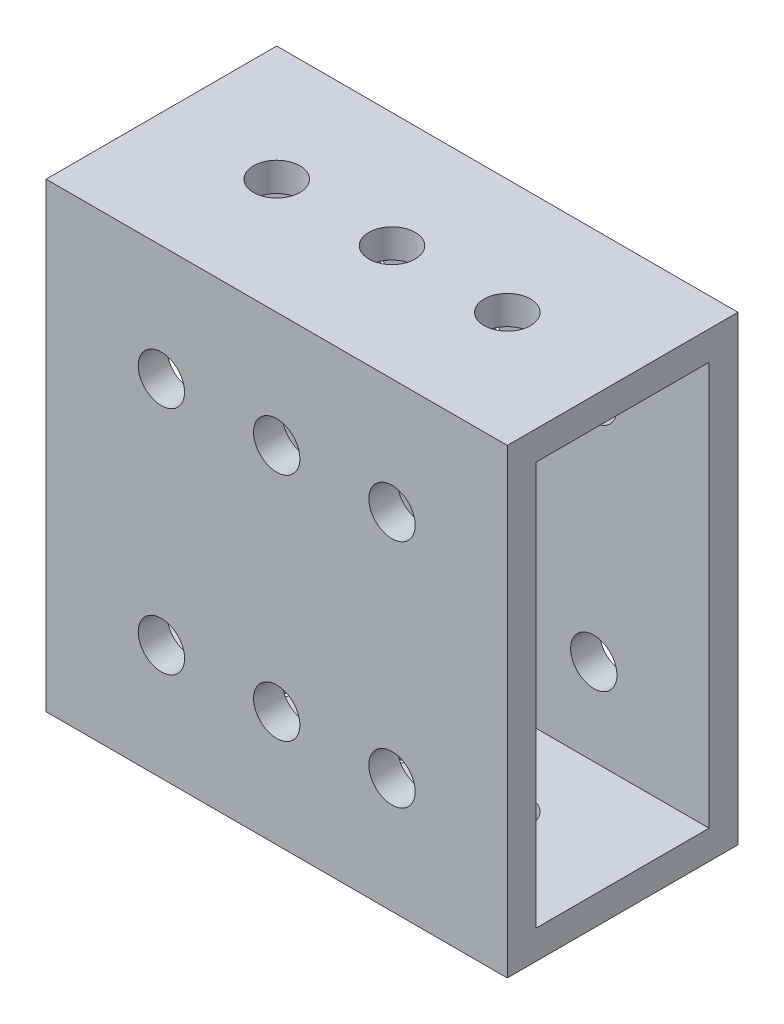
ISO-10303-21;
HEADER;
FILE_DESCRIPTION(('STEP AP214'),'2;1');
FILE_NAME('part.step','',(''),(''),'','','');
FILE_SCHEMA(('AUTOMOTIVE_DESIGN { 1 0 10303 214 1 1 1 1 }'));
ENDSEC;
DATA;
#1=APPLICATION_CONTEXT('core data for automotive mechanical design processes');
#2=APPLICATION_PROTOCOL_DEFINITION('international standard','automotive_design',2000,#1);
#3=PRODUCT_CONTEXT('',#1,'mechanical');
#4=PRODUCT('Part','Part','',(#3));
#5=PRODUCT_RELATED_PRODUCT_CATEGORY('part','',(#4));
#6=PRODUCT_DEFINITION_FORMATION('','',#4);
#7=PRODUCT_DEFINITION_CONTEXT('part definition',#1,'design');
#8=PRODUCT_DEFINITION('design','',#6,#7);
#9=PRODUCT_DEFINITION_SHAPE('','',#8);
#10=(LENGTH_UNIT() NAMED_UNIT(*) SI_UNIT(.MILLI.,.METRE.));
#11=(NAMED_UNIT(*) PLANE_ANGLE_UNIT() SI_UNIT($,.RADIAN.));
#12=(NAMED_UNIT(*) SI_UNIT($,.STERADIAN.) SOLID_ANGLE_UNIT());
#13=UNCERTAINTY_MEASURE_WITH_UNIT(LENGTH_MEASURE(1.E-05),#10,'distance_accuracy_value','');
#14=(GEOMETRIC_REPRESENTATION_CONTEXT(3) GLOBAL_UNCERTAINTY_ASSIGNED_CONTEXT((#13)) GLOBAL_UNIT_ASSIGNED_CONTEXT((#10,
#11,#12)) REPRESENTATION_CONTEXT('',''));
#15=CARTESIAN_POINT('',(0.,0.,0.));
#16=DIRECTION('',(0.,0.,1.));
#17=DIRECTION('',(1.,0.,0.));
#18=AXIS2_PLACEMENT_3D('',#15,#16,#17);
#19=CARTESIAN_POINT('',(0.,0.,25.4));
#20=DIRECTION('',(1.,0.,0.));
#21=DIRECTION('',(0.,0.,-1.));
#22=AXIS2_PLACEMENT_3D('',#19,#20,#21);
#23=PLANE('',#22);
#24=DIRECTION('',(0.,0.,-1.));
#25=VECTOR('',#24,1.);
#26=CARTESIAN_POINT('',(0.,3.175,22.225));
#27=LINE('',#26,#25);
#28=CARTESIAN_POINT('',(0.,3.175,22.225));
#29=VERTEX_POINT('',#28);
#30=CARTESIAN_POINT('',(0.,3.175,3.175));
#31=VERTEX_POINT('',#30);
#32=EDGE_CURVE('E108',#29,#31,#27,.T.);
#33=ORIENTED_EDGE('',*,*,#32,.T.);
#34=DIRECTION('',(0.,1.,0.));
#35=VECTOR('',#34,1.);
#36=CARTESIAN_POINT('',(0.,3.175,3.175));
#37=LINE('',#36,#35);
#38=CARTESIAN_POINT('',(0.,47.625,3.175));
#39=VERTEX_POINT('',#38);
#40=EDGE_CURVE('E102',#31,#39,#37,.T.);
#41=ORIENTED_EDGE('',*,*,#40,.T.);
#42=DIRECTION('',(0.,0.,1.));
#43=VECTOR('',#42,1.);
#44=CARTESIAN_POINT('',(0.,47.625,22.225));
#45=LINE('',#44,#43);
#46=CARTESIAN_POINT('',(0.,47.625,22.225));
#47=VERTEX_POINT('',#46);
#48=EDGE_CURVE('E111',#39,#47,#45,.T.);
#49=ORIENTED_EDGE('',*,*,#48,.T.);
#50=DIRECTION('',(0.,-1.,0.));
#51=VECTOR('',#50,1.);
#52=CARTESIAN_POINT('',(0.,3.175,22.225));
#53=LINE('',#52,#51);
#54=EDGE_CURVE('E50',#47,#29,#53,.T.);
#55=ORIENTED_EDGE('',*,*,#54,.T.);
#56=EDGE_LOOP('',(#33,#41,#49,#55));
#57=FACE_BOUND('',#56,.T.);
#58=DIRECTION('',(0.,-1.,0.));
#59=VECTOR('',#58,1.);
#60=CARTESIAN_POINT('',(0.,0.,0.));
#61=LINE('',#60,#59);
#62=CARTESIAN_POINT('',(0.,50.8,0.));
#63=VERTEX_POINT('',#62);
#64=CARTESIAN_POINT('',(0.,0.,0.));
#65=VERTEX_POINT('',#64);
#66=EDGE_CURVE('E135',#63,#65,#61,.T.);
#67=ORIENTED_EDGE('',*,*,#66,.T.);
#68=DIRECTION('',(0.,0.,-1.));
#69=VECTOR('',#68,1.);
#70=CARTESIAN_POINT('',(0.,0.,25.4));
#71=LINE('',#70,#69);
#72=CARTESIAN_POINT('',(0.,0.,25.4));
#73=VERTEX_POINT('',#72);
#74=EDGE_CURVE('E11',#73,#65,#71,.T.);
#75=ORIENTED_EDGE('',*,*,#74,.F.);
#76=DIRECTION('',(0.,-1.,0.));
#77=VECTOR('',#76,1.);
#78=CARTESIAN_POINT('',(0.,0.,25.4));
#79=LINE('',#78,#77);
#80=CARTESIAN_POINT('',(0.,50.8,25.4));
#81=VERTEX_POINT('',#80);
#82=EDGE_CURVE('E139',#81,#73,#79,.T.);
#83=ORIENTED_EDGE('',*,*,#82,.F.);
#84=DIRECTION('',(0.,0.,-1.));
#85=VECTOR('',#84,1.);
#86=CARTESIAN_POINT('',(0.,50.8,25.4));
#87=LINE('',#86,#85);
#88=EDGE_CURVE('E149',#81,#63,#87,.T.);
#89=ORIENTED_EDGE('',*,*,#88,.T.);
#90=EDGE_LOOP('',(#67,#75,#83,#89));
#91=FACE_BOUND('',#90,.T.);
#92=ADVANCED_FACE('F34',(#57,#91),#23,.F.);
#93=CARTESIAN_POINT('',(0.,0.,25.4));
#94=DIRECTION('',(0.,1.,0.));
#95=DIRECTION('',(0.,0.,1.));
#96=AXIS2_PLACEMENT_3D('',#93,#94,#95);
#97=PLANE('',#96);
#98=CARTESIAN_POINT('',(12.7,0.,12.7));
#99=DIRECTION('',(0.,1.,0.));
#100=DIRECTION('',(0.,0.,1.));
#101=AXIS2_PLACEMENT_3D('',#98,#99,#100);
#102=CIRCLE('',#101,2.5527);
#103=CARTESIAN_POINT('',(12.7,0.,15.2527));
#104=VERTEX_POINT('',#103);
#105=EDGE_CURVE('E168',#104,#104,#102,.T.);
#106=ORIENTED_EDGE('',*,*,#105,.T.);
#107=EDGE_LOOP('',(#106));
#108=FACE_BOUND('',#107,.T.);
#109=CARTESIAN_POINT('',(25.4,0.,12.7));
#110=DIRECTION('',(0.,1.,0.));
#111=DIRECTION('',(0.,0.,1.));
#112=AXIS2_PLACEMENT_3D('',#109,#110,#111);
#113=CIRCLE('',#112,2.5527);
#114=CARTESIAN_POINT('',(25.4,0.,15.2527));
#115=VERTEX_POINT('',#114);
#116=EDGE_CURVE('E215',#115,#115,#113,.T.);
#117=ORIENTED_EDGE('',*,*,#116,.T.);
#118=EDGE_LOOP('',(#117));
#119=FACE_BOUND('',#118,.T.);
#120=CARTESIAN_POINT('',(38.1,0.,12.7));
#121=DIRECTION('',(0.,1.,0.));
#122=DIRECTION('',(0.,0.,1.));
#123=AXIS2_PLACEMENT_3D('',#120,#121,#122);
#124=CIRCLE('',#123,2.5527);
#125=CARTESIAN_POINT('',(38.1,0.,15.2527));
#126=VERTEX_POINT('',#125);
#127=EDGE_CURVE('E221',#126,#126,#124,.T.);
#128=ORIENTED_EDGE('',*,*,#127,.T.);
#129=EDGE_LOOP('',(#128));
#130=FACE_BOUND('',#129,.T.);
#131=DIRECTION('',(1.,0.,0.));
#132=VECTOR('',#131,1.);
#133=CARTESIAN_POINT('',(0.,0.,0.));
#134=LINE('',#133,#132);
#135=CARTESIAN_POINT('',(50.8,0.,0.));
#136=VERTEX_POINT('',#135);
#137=EDGE_CURVE('E152',#65,#136,#134,.T.);
#138=ORIENTED_EDGE('',*,*,#137,.T.);
#139=DIRECTION('',(0.,0.,-1.));
#140=VECTOR('',#139,1.);
#141=CARTESIAN_POINT('',(50.8,0.,25.4));
#142=LINE('',#141,#140);
#143=CARTESIAN_POINT('',(50.8,0.,25.4));
#144=VERTEX_POINT('',#143);
#145=EDGE_CURVE('E42',#144,#136,#142,.T.);
#146=ORIENTED_EDGE('',*,*,#145,.F.);
#147=DIRECTION('',(1.,0.,0.));
#148=VECTOR('',#147,1.);
#149=CARTESIAN_POINT('',(0.,0.,25.4));
#150=LINE('',#149,#148);
#151=EDGE_CURVE('E142',#73,#144,#150,.T.);
#152=ORIENTED_EDGE('',*,*,#151,.F.);
#153=ORIENTED_EDGE('',*,*,#74,.T.);
#154=EDGE_LOOP('',(#138,#146,#152,#153));
#155=FACE_BOUND('',#154,.T.);
#156=ADVANCED_FACE('F255',(#108,#119,#130,#155),#97,.F.);
#157=CARTESIAN_POINT('',(50.8,0.,25.4));
#158=DIRECTION('',(-1.,0.,0.));
#159=DIRECTION('',(0.,0.,1.));
#160=AXIS2_PLACEMENT_3D('',#157,#158,#159);
#161=PLANE('',#160);
#162=DIRECTION('',(0.,0.,1.));
#163=VECTOR('',#162,1.);
#164=CARTESIAN_POINT('',(50.8,47.625,22.225));
#165=LINE('',#164,#163);
#166=CARTESIAN_POINT('',(50.8,47.625,3.175));
#167=VERTEX_POINT('',#166);
#168=CARTESIAN_POINT('',(50.8,47.625,22.225));
#169=VERTEX_POINT('',#168);
#170=EDGE_CURVE('E129',#167,#169,#165,.T.);
#171=ORIENTED_EDGE('',*,*,#170,.F.);
#172=DIRECTION('',(0.,1.,0.));
#173=VECTOR('',#172,1.);
#174=CARTESIAN_POINT('',(50.8,3.175,3.175));
#175=LINE('',#174,#173);
#176=CARTESIAN_POINT('',(50.8,3.175,3.175));
#177=VERTEX_POINT('',#176);
#178=EDGE_CURVE('E58',#177,#167,#175,.T.);
#179=ORIENTED_EDGE('',*,*,#178,.F.);
#180=DIRECTION('',(0.,0.,-1.));
#181=VECTOR('',#180,1.);
#182=CARTESIAN_POINT('',(50.8,3.175,22.225));
#183=LINE('',#182,#181);
#184=CARTESIAN_POINT('',(50.8,3.175,22.225));
#185=VERTEX_POINT('',#184);
#186=EDGE_CURVE('E117',#185,#177,#183,.T.);
#187=ORIENTED_EDGE('',*,*,#186,.F.);
#188=DIRECTION('',(0.,-1.,0.));
#189=VECTOR('',#188,1.);
#190=CARTESIAN_POINT('',(50.8,3.175,22.225));
#191=LINE('',#190,#189);
#192=EDGE_CURVE('E120',#169,#185,#191,.T.);
#193=ORIENTED_EDGE('',*,*,#192,.F.);
#194=EDGE_LOOP('',(#171,#179,#187,#193));
#195=FACE_BOUND('',#194,.T.);
#196=DIRECTION('',(0.,1.,0.));
#197=VECTOR('',#196,1.);
#198=CARTESIAN_POINT('',(50.8,0.,0.));
#199=LINE('',#198,#197);
#200=CARTESIAN_POINT('',(50.8,50.8,0.));
#201=VERTEX_POINT('',#200);
#202=EDGE_CURVE('E154',#136,#201,#199,.T.);
#203=ORIENTED_EDGE('',*,*,#202,.T.);
#204=DIRECTION('',(0.,0.,-1.));
#205=VECTOR('',#204,1.);
#206=CARTESIAN_POINT('',(50.8,50.8,25.4));
#207=LINE('',#206,#205);
#208=CARTESIAN_POINT('',(50.8,50.8,25.4));
#209=VERTEX_POINT('',#208);
#210=EDGE_CURVE('E159',#209,#201,#207,.T.);
#211=ORIENTED_EDGE('',*,*,#210,.F.);
#212=DIRECTION('',(0.,1.,0.));
#213=VECTOR('',#212,1.);
#214=CARTESIAN_POINT('',(50.8,0.,25.4));
#215=LINE('',#214,#213);
#216=EDGE_CURVE('E145',#144,#209,#215,.T.);
#217=ORIENTED_EDGE('',*,*,#216,.F.);
#218=ORIENTED_EDGE('',*,*,#145,.T.);
#219=EDGE_LOOP('',(#203,#211,#217,#218));
#220=FACE_BOUND('',#219,.T.);
#221=ADVANCED_FACE('F259',(#195,#220),#161,.F.);
#222=CARTESIAN_POINT('',(0.,50.8,25.4));
#223=DIRECTION('',(0.,-1.,0.));
#224=DIRECTION('',(0.,0.,-1.));
#225=AXIS2_PLACEMENT_3D('',#222,#223,#224);
#226=PLANE('',#225);
#227=CARTESIAN_POINT('',(12.7,50.8,12.7));
#228=DIRECTION('',(0.,1.,0.));
#229=DIRECTION('',(0.,0.,1.));
#230=AXIS2_PLACEMENT_3D('',#227,#228,#229);
#231=CIRCLE('',#230,2.5527);
#232=CARTESIAN_POINT('',(12.7,50.8,15.2527));
#233=VERTEX_POINT('',#232);
#234=EDGE_CURVE('E212',#233,#233,#231,.T.);
#235=ORIENTED_EDGE('',*,*,#234,.F.);
#236=EDGE_LOOP('',(#235));
#237=FACE_BOUND('',#236,.T.);
#238=CARTESIAN_POINT('',(25.4,50.8,12.7));
#239=DIRECTION('',(0.,1.,0.));
#240=DIRECTION('',(0.,0.,1.));
#241=AXIS2_PLACEMENT_3D('',#238,#239,#240);
#242=CIRCLE('',#241,2.5527);
#243=CARTESIAN_POINT('',(25.4,50.8,15.2527));
#244=VERTEX_POINT('',#243);
#245=EDGE_CURVE('E218',#244,#244,#242,.T.);
#246=ORIENTED_EDGE('',*,*,#245,.F.);
#247=EDGE_LOOP('',(#246));
#248=FACE_BOUND('',#247,.T.);
#249=CARTESIAN_POINT('',(38.1,50.8,12.7));
#250=DIRECTION('',(0.,1.,0.));
#251=DIRECTION('',(0.,0.,1.));
#252=AXIS2_PLACEMENT_3D('',#249,#250,#251);
#253=CIRCLE('',#252,2.5527);
#254=CARTESIAN_POINT('',(38.1,50.8,15.2527));
#255=VERTEX_POINT('',#254);
#256=EDGE_CURVE('E209',#255,#255,#253,.T.);
#257=ORIENTED_EDGE('',*,*,#256,.F.);
#258=EDGE_LOOP('',(#257));
#259=FACE_BOUND('',#258,.T.);
#260=DIRECTION('',(-1.,0.,0.));
#261=VECTOR('',#260,1.);
#262=CARTESIAN_POINT('',(0.,50.8,0.));
#263=LINE('',#262,#261);
#264=EDGE_CURVE('E143',#201,#63,#263,.T.);
#265=ORIENTED_EDGE('',*,*,#264,.T.);
#266=ORIENTED_EDGE('',*,*,#88,.F.);
#267=DIRECTION('',(-1.,0.,0.));
#268=VECTOR('',#267,1.);
#269=CARTESIAN_POINT('',(0.,50.8,25.4));
#270=LINE('',#269,#268);
#271=EDGE_CURVE('E147',#209,#81,#270,.T.);
#272=ORIENTED_EDGE('',*,*,#271,.F.);
#273=ORIENTED_EDGE('',*,*,#210,.T.);
#274=EDGE_LOOP('',(#265,#266,#272,#273));
#275=FACE_BOUND('',#274,.T.);
#276=ADVANCED_FACE('F264',(#237,#248,#259,#275),#226,.F.);
#277=CARTESIAN_POINT('',(0.,0.,25.4));
#278=DIRECTION('',(0.,0.,-1.));
#279=DIRECTION('',(-1.,0.,0.));
#280=AXIS2_PLACEMENT_3D('',#277,#278,#279);
#281=PLANE('',#280);
#282=CARTESIAN_POINT('',(25.4,38.1,25.4));
#283=DIRECTION('',(0.,0.,-1.));
#284=DIRECTION('',(-1.,0.,0.));
#285=AXIS2_PLACEMENT_3D('',#282,#283,#284);
#286=CIRCLE('',#285,2.5527);
#287=CARTESIAN_POINT('',(22.8473,38.1,25.4));
#288=VERTEX_POINT('',#287);
#289=EDGE_CURVE('E524',#288,#288,#286,.T.);
#290=ORIENTED_EDGE('',*,*,#289,.T.);
#291=EDGE_LOOP('',(#290));
#292=FACE_BOUND('',#291,.T.);
#293=CARTESIAN_POINT('',(12.7,38.1,25.4));
#294=DIRECTION('',(0.,0.,-1.));
#295=DIRECTION('',(-1.,0.,0.));
#296=AXIS2_PLACEMENT_3D('',#293,#294,#295);
#297=CIRCLE('',#296,2.5527);
#298=CARTESIAN_POINT('',(10.1473,38.1,25.4));
#299=VERTEX_POINT('',#298);
#300=EDGE_CURVE('E543',#299,#299,#297,.T.);
#301=ORIENTED_EDGE('',*,*,#300,.T.);
#302=EDGE_LOOP('',(#301));
#303=FACE_BOUND('',#302,.T.);
#304=CARTESIAN_POINT('',(38.1,12.7,25.4));
#305=DIRECTION('',(0.,0.,-1.));
#306=DIRECTION('',(-1.,0.,0.));
#307=AXIS2_PLACEMENT_3D('',#304,#305,#306);
#308=CIRCLE('',#307,2.5527);
#309=CARTESIAN_POINT('',(35.5473,12.7,25.4));
#310=VERTEX_POINT('',#309);
#311=EDGE_CURVE('E537',#310,#310,#308,.T.);
#312=ORIENTED_EDGE('',*,*,#311,.T.);
#313=EDGE_LOOP('',(#312));
#314=FACE_BOUND('',#313,.T.);
#315=CARTESIAN_POINT('',(25.4,12.7,25.4));
#316=DIRECTION('',(0.,0.,-1.));
#317=DIRECTION('',(-1.,0.,0.));
#318=AXIS2_PLACEMENT_3D('',#315,#316,#317);
#319=CIRCLE('',#318,2.5527);
#320=CARTESIAN_POINT('',(22.8473,12.7,25.4));
#321=VERTEX_POINT('',#320);
#322=EDGE_CURVE('E530',#321,#321,#319,.T.);
#323=ORIENTED_EDGE('',*,*,#322,.T.);
#324=EDGE_LOOP('',(#323));
#325=FACE_BOUND('',#324,.T.);
#326=CARTESIAN_POINT('',(12.7,12.7,25.4));
#327=DIRECTION('',(0.,0.,-1.));
#328=DIRECTION('',(-1.,0.,0.));
#329=AXIS2_PLACEMENT_3D('',#326,#327,#328);
#330=CIRCLE('',#329,2.5527);
#331=CARTESIAN_POINT('',(10.1473,12.7,25.4));
#332=VERTEX_POINT('',#331);
#333=EDGE_CURVE('E531',#332,#332,#330,.T.);
#334=ORIENTED_EDGE('',*,*,#333,.T.);
#335=EDGE_LOOP('',(#334));
#336=FACE_BOUND('',#335,.T.);
#337=CARTESIAN_POINT('',(38.1,38.1,25.4));
#338=DIRECTION('',(0.,0.,-1.));
#339=DIRECTION('',(-1.,0.,0.));
#340=AXIS2_PLACEMENT_3D('',#337,#338,#339);
#341=CIRCLE('',#340,2.5527);
#342=CARTESIAN_POINT('',(35.5473,38.1,25.4));
#343=VERTEX_POINT('',#342);
#344=EDGE_CURVE('E180',#343,#343,#341,.T.);
#345=ORIENTED_EDGE('',*,*,#344,.T.);
#346=EDGE_LOOP('',(#345));
#347=FACE_BOUND('',#346,.T.);
#348=ORIENTED_EDGE('',*,*,#82,.T.);
#349=ORIENTED_EDGE('',*,*,#151,.T.);
#350=ORIENTED_EDGE('',*,*,#216,.T.);
#351=ORIENTED_EDGE('',*,*,#271,.T.);
#352=EDGE_LOOP('',(#348,#349,#350,#351));
#353=FACE_BOUND('',#352,.T.);
#354=ADVANCED_FACE('F271',(#292,#303,#314,#325,#336,#347,#353),#281,.F.);
#355=CARTESIAN_POINT('',(0.,0.,0.));
#356=DIRECTION('',(0.,0.,-1.));
#357=DIRECTION('',(-1.,0.,0.));
#358=AXIS2_PLACEMENT_3D('',#355,#356,#357);
#359=PLANE('',#358);
#360=CARTESIAN_POINT('',(25.4,38.1,0.));
#361=DIRECTION('',(0.,0.,-1.));
#362=DIRECTION('',(-1.,0.,0.));
#363=AXIS2_PLACEMENT_3D('',#360,#361,#362);
#364=CIRCLE('',#363,2.5527);
#365=CARTESIAN_POINT('',(22.8473,38.1,0.));
#366=VERTEX_POINT('',#365);
#367=EDGE_CURVE('E505',#366,#366,#364,.T.);
#368=ORIENTED_EDGE('',*,*,#367,.F.);
#369=EDGE_LOOP('',(#368));
#370=FACE_BOUND('',#369,.T.);
#371=CARTESIAN_POINT('',(12.7,38.1,0.));
#372=DIRECTION('',(0.,0.,-1.));
#373=DIRECTION('',(-1.,0.,0.));
#374=AXIS2_PLACEMENT_3D('',#371,#372,#373);
#375=CIRCLE('',#374,2.5527);
#376=CARTESIAN_POINT('',(10.1473,38.1,0.));
#377=VERTEX_POINT('',#376);
#378=EDGE_CURVE('E540',#377,#377,#375,.T.);
#379=ORIENTED_EDGE('',*,*,#378,.F.);
#380=EDGE_LOOP('',(#379));
#381=FACE_BOUND('',#380,.T.);
#382=CARTESIAN_POINT('',(38.1,12.7,0.));
#383=DIRECTION('',(0.,0.,-1.));
#384=DIRECTION('',(-1.,0.,0.));
#385=AXIS2_PLACEMENT_3D('',#382,#383,#384);
#386=CIRCLE('',#385,2.5527);
#387=CARTESIAN_POINT('',(35.5473,12.7,0.));
#388=VERTEX_POINT('',#387);
#389=EDGE_CURVE('E534',#388,#388,#386,.T.);
#390=ORIENTED_EDGE('',*,*,#389,.F.);
#391=EDGE_LOOP('',(#390));
#392=FACE_BOUND('',#391,.T.);
#393=CARTESIAN_POINT('',(25.4,12.7,0.));
#394=DIRECTION('',(0.,0.,-1.));
#395=DIRECTION('',(-1.,0.,0.));
#396=AXIS2_PLACEMENT_3D('',#393,#394,#395);
#397=CIRCLE('',#396,2.5527);
#398=CARTESIAN_POINT('',(22.8473,12.7,0.));
#399=VERTEX_POINT('',#398);
#400=EDGE_CURVE('E527',#399,#399,#397,.T.);
#401=ORIENTED_EDGE('',*,*,#400,.F.);
#402=EDGE_LOOP('',(#401));
#403=FACE_BOUND('',#402,.T.);
#404=CARTESIAN_POINT('',(12.7,12.7,0.));
#405=DIRECTION('',(0.,0.,-1.));
#406=DIRECTION('',(-1.,0.,0.));
#407=AXIS2_PLACEMENT_3D('',#404,#405,#406);
#408=CIRCLE('',#407,2.5527);
#409=CARTESIAN_POINT('',(10.1473,12.7,0.));
#410=VERTEX_POINT('',#409);
#411=EDGE_CURVE('E549',#410,#410,#408,.T.);
#412=ORIENTED_EDGE('',*,*,#411,.F.);
#413=EDGE_LOOP('',(#412));
#414=FACE_BOUND('',#413,.T.);
#415=CARTESIAN_POINT('',(38.1,38.1,0.));
#416=DIRECTION('',(0.,0.,-1.));
#417=DIRECTION('',(-1.,0.,0.));
#418=AXIS2_PLACEMENT_3D('',#415,#416,#417);
#419=CIRCLE('',#418,2.5527);
#420=CARTESIAN_POINT('',(35.5473,38.1,0.));
#421=VERTEX_POINT('',#420);
#422=EDGE_CURVE('E521',#421,#421,#419,.T.);
#423=ORIENTED_EDGE('',*,*,#422,.F.);
#424=EDGE_LOOP('',(#423));
#425=FACE_BOUND('',#424,.T.);
#426=ORIENTED_EDGE('',*,*,#66,.F.);
#427=ORIENTED_EDGE('',*,*,#264,.F.);
#428=ORIENTED_EDGE('',*,*,#202,.F.);
#429=ORIENTED_EDGE('',*,*,#137,.F.);
#430=EDGE_LOOP('',(#426,#427,#428,#429));
#431=FACE_BOUND('',#430,.T.);
#432=ADVANCED_FACE('F273',(#370,#381,#392,#403,#414,#425,#431),#359,.T.);
#433=CARTESIAN_POINT('',(0.,3.175,3.175));
#434=DIRECTION('',(0.,0.,-1.));
#435=DIRECTION('',(0.,1.,0.));
#436=AXIS2_PLACEMENT_3D('',#433,#434,#435);
#437=PLANE('',#436);
#438=CARTESIAN_POINT('',(25.4,38.1,3.175));
#439=DIRECTION('',(0.,0.,-1.));
#440=DIRECTION('',(0.,1.,0.));
#441=AXIS2_PLACEMENT_3D('',#438,#439,#440);
#442=CIRCLE('',#441,2.5527);
#443=CARTESIAN_POINT('',(25.4,40.6527,3.175));
#444=VERTEX_POINT('',#443);
#445=EDGE_CURVE('E206',#444,#444,#442,.T.);
#446=ORIENTED_EDGE('',*,*,#445,.T.);
#447=EDGE_LOOP('',(#446));
#448=FACE_BOUND('',#447,.T.);
#449=CARTESIAN_POINT('',(12.7,38.1,3.175));
#450=DIRECTION('',(0.,0.,-1.));
#451=DIRECTION('',(0.,1.,0.));
#452=AXIS2_PLACEMENT_3D('',#449,#450,#451);
#453=CIRCLE('',#452,2.5527);
#454=CARTESIAN_POINT('',(12.7,40.6527,3.175));
#455=VERTEX_POINT('',#454);
#456=EDGE_CURVE('E194',#455,#455,#453,.T.);
#457=ORIENTED_EDGE('',*,*,#456,.T.);
#458=EDGE_LOOP('',(#457));
#459=FACE_BOUND('',#458,.T.);
#460=CARTESIAN_POINT('',(38.1,12.7,3.175));
#461=DIRECTION('',(0.,0.,-1.));
#462=DIRECTION('',(0.,1.,0.));
#463=AXIS2_PLACEMENT_3D('',#460,#461,#462);
#464=CIRCLE('',#463,2.5527);
#465=CARTESIAN_POINT('',(38.1,15.2527,3.175));
#466=VERTEX_POINT('',#465);
#467=EDGE_CURVE('E191',#466,#466,#464,.T.);
#468=ORIENTED_EDGE('',*,*,#467,.T.);
#469=EDGE_LOOP('',(#468));
#470=FACE_BOUND('',#469,.T.);
#471=CARTESIAN_POINT('',(25.4,12.7,3.175));
#472=DIRECTION('',(0.,0.,-1.));
#473=DIRECTION('',(0.,1.,0.));
#474=AXIS2_PLACEMENT_3D('',#471,#472,#473);
#475=CIRCLE('',#474,2.5527);
#476=CARTESIAN_POINT('',(25.4,15.2527,3.175));
#477=VERTEX_POINT('',#476);
#478=EDGE_CURVE('E188',#477,#477,#475,.T.);
#479=ORIENTED_EDGE('',*,*,#478,.T.);
#480=EDGE_LOOP('',(#479));
#481=FACE_BOUND('',#480,.T.);
#482=CARTESIAN_POINT('',(12.7,12.7,3.175));
#483=DIRECTION('',(0.,0.,-1.));
#484=DIRECTION('',(0.,1.,0.));
#485=AXIS2_PLACEMENT_3D('',#482,#483,#484);
#486=CIRCLE('',#485,2.5527);
#487=CARTESIAN_POINT('',(12.7,15.2527,3.175));
#488=VERTEX_POINT('',#487);
#489=EDGE_CURVE('E184',#488,#488,#486,.T.);
#490=ORIENTED_EDGE('',*,*,#489,.T.);
#491=EDGE_LOOP('',(#490));
#492=FACE_BOUND('',#491,.T.);
#493=CARTESIAN_POINT('',(38.1,38.1,3.175));
#494=DIRECTION('',(0.,0.,-1.));
#495=DIRECTION('',(0.,1.,0.));
#496=AXIS2_PLACEMENT_3D('',#493,#494,#495);
#497=CIRCLE('',#496,2.5527);
#498=CARTESIAN_POINT('',(38.1,40.6527,3.175));
#499=VERTEX_POINT('',#498);
#500=EDGE_CURVE('E179',#499,#499,#497,.T.);
#501=ORIENTED_EDGE('',*,*,#500,.T.);
#502=EDGE_LOOP('',(#501));
#503=FACE_BOUND('',#502,.T.);
#504=ORIENTED_EDGE('',*,*,#178,.T.);
#505=DIRECTION('',(1.,0.,0.));
#506=VECTOR('',#505,1.);
#507=CARTESIAN_POINT('',(0.,47.625,3.175));
#508=LINE('',#507,#506);
#509=EDGE_CURVE('E98',#39,#167,#508,.T.);
#510=ORIENTED_EDGE('',*,*,#509,.F.);
#511=ORIENTED_EDGE('',*,*,#40,.F.);
#512=DIRECTION('',(1.,0.,0.));
#513=VECTOR('',#512,1.);
#514=CARTESIAN_POINT('',(0.,3.175,3.175));
#515=LINE('',#514,#513);
#516=EDGE_CURVE('E133',#31,#177,#515,.T.);
#517=ORIENTED_EDGE('',*,*,#516,.T.);
#518=EDGE_LOOP('',(#504,#510,#511,#517));
#519=FACE_BOUND('',#518,.T.);
#520=ADVANCED_FACE('F100',(#448,#459,#470,#481,#492,#503,#519),#437,.F.);
#521=CARTESIAN_POINT('',(0.,3.175,22.225));
#522=DIRECTION('',(0.,-1.,0.));
#523=DIRECTION('',(0.,0.,-1.));
#524=AXIS2_PLACEMENT_3D('',#521,#522,#523);
#525=PLANE('',#524);
#526=CARTESIAN_POINT('',(12.7,3.175,12.7));
#527=DIRECTION('',(0.,-1.,0.));
#528=DIRECTION('',(0.,0.,-1.));
#529=AXIS2_PLACEMENT_3D('',#526,#527,#528);
#530=CIRCLE('',#529,2.5527);
#531=CARTESIAN_POINT('',(12.7,3.175,10.1473));
#532=VERTEX_POINT('',#531);
#533=EDGE_CURVE('E123',#532,#532,#530,.T.);
#534=ORIENTED_EDGE('',*,*,#533,.T.);
#535=EDGE_LOOP('',(#534));
#536=FACE_BOUND('',#535,.T.);
#537=CARTESIAN_POINT('',(25.4,3.175,12.7));
#538=DIRECTION('',(0.,-1.,0.));
#539=DIRECTION('',(0.,0.,-1.));
#540=AXIS2_PLACEMENT_3D('',#537,#538,#539);
#541=CIRCLE('',#540,2.5527);
#542=CARTESIAN_POINT('',(25.4,3.175,10.1473));
#543=VERTEX_POINT('',#542);
#544=EDGE_CURVE('E172',#543,#543,#541,.T.);
#545=ORIENTED_EDGE('',*,*,#544,.T.);
#546=EDGE_LOOP('',(#545));
#547=FACE_BOUND('',#546,.T.);
#548=CARTESIAN_POINT('',(38.1,3.175,12.7));
#549=DIRECTION('',(0.,-1.,0.));
#550=DIRECTION('',(0.,0.,-1.));
#551=AXIS2_PLACEMENT_3D('',#548,#549,#550);
#552=CIRCLE('',#551,2.5527);
#553=CARTESIAN_POINT('',(38.1,3.175,10.1473));
#554=VERTEX_POINT('',#553);
#555=EDGE_CURVE('E167',#554,#554,#552,.T.);
#556=ORIENTED_EDGE('',*,*,#555,.T.);
#557=EDGE_LOOP('',(#556));
#558=FACE_BOUND('',#557,.T.);
#559=ORIENTED_EDGE('',*,*,#186,.T.);
#560=ORIENTED_EDGE('',*,*,#516,.F.);
#561=ORIENTED_EDGE('',*,*,#32,.F.);
#562=DIRECTION('',(1.,0.,0.));
#563=VECTOR('',#562,1.);
#564=CARTESIAN_POINT('',(0.,3.175,22.225));
#565=LINE('',#564,#563);
#566=EDGE_CURVE('E136',#29,#185,#565,.T.);
#567=ORIENTED_EDGE('',*,*,#566,.T.);
#568=EDGE_LOOP('',(#559,#560,#561,#567));
#569=FACE_BOUND('',#568,.T.);
#570=ADVANCED_FACE('F230',(#536,#547,#558,#569),#525,.F.);
#571=CARTESIAN_POINT('',(0.,3.175,22.225));
#572=DIRECTION('',(0.,0.,1.));
#573=DIRECTION('',(1.,0.,0.));
#574=AXIS2_PLACEMENT_3D('',#571,#572,#573);
#575=PLANE('',#574);
#576=CARTESIAN_POINT('',(25.4,38.1,22.225));
#577=DIRECTION('',(0.,0.,1.));
#578=DIRECTION('',(1.,0.,0.));
#579=AXIS2_PLACEMENT_3D('',#576,#577,#578);
#580=CIRCLE('',#579,2.5527);
#581=CARTESIAN_POINT('',(27.9527,38.1,22.225));
#582=VERTEX_POINT('',#581);
#583=EDGE_CURVE('E37',#582,#582,#580,.T.);
#584=ORIENTED_EDGE('',*,*,#583,.T.);
#585=EDGE_LOOP('',(#584));
#586=FACE_BOUND('',#585,.T.);
#587=CARTESIAN_POINT('',(12.7,38.1,22.225));
#588=DIRECTION('',(0.,0.,1.));
#589=DIRECTION('',(1.,0.,0.));
#590=AXIS2_PLACEMENT_3D('',#587,#588,#589);
#591=CIRCLE('',#590,2.5527);
#592=CARTESIAN_POINT('',(15.2527,38.1,22.225));
#593=VERTEX_POINT('',#592);
#594=EDGE_CURVE('E192',#593,#593,#591,.T.);
#595=ORIENTED_EDGE('',*,*,#594,.T.);
#596=EDGE_LOOP('',(#595));
#597=FACE_BOUND('',#596,.T.);
#598=CARTESIAN_POINT('',(38.1,12.7,22.225));
#599=DIRECTION('',(0.,0.,1.));
#600=DIRECTION('',(1.,0.,0.));
#601=AXIS2_PLACEMENT_3D('',#598,#599,#600);
#602=CIRCLE('',#601,2.5527);
#603=CARTESIAN_POINT('',(40.6527,12.7,22.225));
#604=VERTEX_POINT('',#603);
#605=EDGE_CURVE('E189',#604,#604,#602,.T.);
#606=ORIENTED_EDGE('',*,*,#605,.T.);
#607=EDGE_LOOP('',(#606));
#608=FACE_BOUND('',#607,.T.);
#609=CARTESIAN_POINT('',(25.4,12.7,22.225));
#610=DIRECTION('',(0.,0.,1.));
#611=DIRECTION('',(1.,0.,0.));
#612=AXIS2_PLACEMENT_3D('',#609,#610,#611);
#613=CIRCLE('',#612,2.5527);
#614=CARTESIAN_POINT('',(27.9527,12.7,22.225));
#615=VERTEX_POINT('',#614);
#616=EDGE_CURVE('E185',#615,#615,#613,.T.);
#617=ORIENTED_EDGE('',*,*,#616,.T.);
#618=EDGE_LOOP('',(#617));
#619=FACE_BOUND('',#618,.T.);
#620=CARTESIAN_POINT('',(12.7,12.7,22.225));
#621=DIRECTION('',(0.,0.,1.));
#622=DIRECTION('',(1.,0.,0.));
#623=AXIS2_PLACEMENT_3D('',#620,#621,#622);
#624=CIRCLE('',#623,2.5527);
#625=CARTESIAN_POINT('',(15.2527,12.7,22.225));
#626=VERTEX_POINT('',#625);
#627=EDGE_CURVE('E181',#626,#626,#624,.T.);
#628=ORIENTED_EDGE('',*,*,#627,.T.);
#629=EDGE_LOOP('',(#628));
#630=FACE_BOUND('',#629,.T.);
#631=CARTESIAN_POINT('',(38.1,38.1,22.225));
#632=DIRECTION('',(0.,0.,1.));
#633=DIRECTION('',(1.,0.,0.));
#634=AXIS2_PLACEMENT_3D('',#631,#632,#633);
#635=CIRCLE('',#634,2.5527);
#636=CARTESIAN_POINT('',(40.6527,38.1,22.225));
#637=VERTEX_POINT('',#636);
#638=EDGE_CURVE('E176',#637,#637,#635,.T.);
#639=ORIENTED_EDGE('',*,*,#638,.T.);
#640=EDGE_LOOP('',(#639));
#641=FACE_BOUND('',#640,.T.);
#642=ORIENTED_EDGE('',*,*,#192,.T.);
#643=ORIENTED_EDGE('',*,*,#566,.F.);
#644=ORIENTED_EDGE('',*,*,#54,.F.);
#645=DIRECTION('',(1.,0.,0.));
#646=VECTOR('',#645,1.);
#647=CARTESIAN_POINT('',(0.,47.625,22.225));
#648=LINE('',#647,#646);
#649=EDGE_CURVE('E107',#47,#169,#648,.T.);
#650=ORIENTED_EDGE('',*,*,#649,.T.);
#651=EDGE_LOOP('',(#642,#643,#644,#650));
#652=FACE_BOUND('',#651,.T.);
#653=ADVANCED_FACE('F285',(#586,#597,#608,#619,#630,#641,#652),#575,.F.);
#654=CARTESIAN_POINT('',(0.,47.625,22.225));
#655=DIRECTION('',(0.,1.,0.));
#656=DIRECTION('',(0.,0.,1.));
#657=AXIS2_PLACEMENT_3D('',#654,#655,#656);
#658=PLANE('',#657);
#659=CARTESIAN_POINT('',(12.7,47.625,12.7));
#660=DIRECTION('',(0.,1.,0.));
#661=DIRECTION('',(0.,0.,1.));
#662=AXIS2_PLACEMENT_3D('',#659,#660,#661);
#663=CIRCLE('',#662,2.5527);
#664=CARTESIAN_POINT('',(12.7,47.625,15.2527));
#665=VERTEX_POINT('',#664);
#666=EDGE_CURVE('E173',#665,#665,#663,.T.);
#667=ORIENTED_EDGE('',*,*,#666,.T.);
#668=EDGE_LOOP('',(#667));
#669=FACE_BOUND('',#668,.T.);
#670=CARTESIAN_POINT('',(25.4,47.625,12.7));
#671=DIRECTION('',(0.,1.,0.));
#672=DIRECTION('',(0.,0.,1.));
#673=AXIS2_PLACEMENT_3D('',#670,#671,#672);
#674=CIRCLE('',#673,2.5527);
#675=CARTESIAN_POINT('',(25.4,47.625,15.2527));
#676=VERTEX_POINT('',#675);
#677=EDGE_CURVE('E169',#676,#676,#674,.T.);
#678=ORIENTED_EDGE('',*,*,#677,.T.);
#679=EDGE_LOOP('',(#678));
#680=FACE_BOUND('',#679,.T.);
#681=CARTESIAN_POINT('',(38.1,47.625,12.7));
#682=DIRECTION('',(0.,1.,0.));
#683=DIRECTION('',(0.,0.,1.));
#684=AXIS2_PLACEMENT_3D('',#681,#682,#683);
#685=CIRCLE('',#684,2.5527);
#686=CARTESIAN_POINT('',(38.1,47.625,15.2527));
#687=VERTEX_POINT('',#686);
#688=EDGE_CURVE('E164',#687,#687,#685,.T.);
#689=ORIENTED_EDGE('',*,*,#688,.T.);
#690=EDGE_LOOP('',(#689));
#691=FACE_BOUND('',#690,.T.);
#692=ORIENTED_EDGE('',*,*,#170,.T.);
#693=ORIENTED_EDGE('',*,*,#649,.F.);
#694=ORIENTED_EDGE('',*,*,#48,.F.);
#695=ORIENTED_EDGE('',*,*,#509,.T.);
#696=EDGE_LOOP('',(#692,#693,#694,#695));
#697=FACE_BOUND('',#696,.T.);
#698=ADVANCED_FACE('F112',(#669,#680,#691,#697),#658,.F.);
#699=CARTESIAN_POINT('',(38.1,0.,12.7));
#700=DIRECTION('',(0.,1.,0.));
#701=DIRECTION('',(0.,0.,1.));
#702=AXIS2_PLACEMENT_3D('',#699,#700,#701);
#703=CYLINDRICAL_SURFACE('',#702,2.5527);
#704=ORIENTED_EDGE('',*,*,#256,.T.);
#705=EDGE_LOOP('',(#704));
#706=FACE_BOUND('',#705,.T.);
#707=ORIENTED_EDGE('',*,*,#688,.F.);
#708=EDGE_LOOP('',(#707));
#709=FACE_BOUND('',#708,.T.);
#710=ADVANCED_FACE('F250',(#706,#709),#703,.F.);
#711=CARTESIAN_POINT('',(25.4,0.,12.7));
#712=DIRECTION('',(0.,1.,0.));
#713=DIRECTION('',(0.,0.,1.));
#714=AXIS2_PLACEMENT_3D('',#711,#712,#713);
#715=CYLINDRICAL_SURFACE('',#714,2.5527);
#716=ORIENTED_EDGE('',*,*,#245,.T.);
#717=EDGE_LOOP('',(#716));
#718=FACE_BOUND('',#717,.T.);
#719=ORIENTED_EDGE('',*,*,#677,.F.);
#720=EDGE_LOOP('',(#719));
#721=FACE_BOUND('',#720,.T.);
#722=ADVANCED_FACE('F239',(#718,#721),#715,.F.);
#723=CARTESIAN_POINT('',(12.7,0.,12.7));
#724=DIRECTION('',(0.,1.,0.));
#725=DIRECTION('',(0.,0.,1.));
#726=AXIS2_PLACEMENT_3D('',#723,#724,#725);
#727=CYLINDRICAL_SURFACE('',#726,2.5527);
#728=ORIENTED_EDGE('',*,*,#234,.T.);
#729=EDGE_LOOP('',(#728));
#730=FACE_BOUND('',#729,.T.);
#731=ORIENTED_EDGE('',*,*,#666,.F.);
#732=EDGE_LOOP('',(#731));
#733=FACE_BOUND('',#732,.T.);
#734=ADVANCED_FACE('F247',(#730,#733),#727,.F.);
#735=ORIENTED_EDGE('',*,*,#127,.F.);
#736=EDGE_LOOP('',(#735));
#737=FACE_BOUND('',#736,.T.);
#738=ORIENTED_EDGE('',*,*,#555,.F.);
#739=EDGE_LOOP('',(#738));
#740=FACE_BOUND('',#739,.T.);
#741=ADVANCED_FACE('F236',(#737,#740),#703,.F.);
#742=ORIENTED_EDGE('',*,*,#116,.F.);
#743=EDGE_LOOP('',(#742));
#744=FACE_BOUND('',#743,.T.);
#745=ORIENTED_EDGE('',*,*,#544,.F.);
#746=EDGE_LOOP('',(#745));
#747=FACE_BOUND('',#746,.T.);
#748=ADVANCED_FACE('F233',(#744,#747),#715,.F.);
#749=ORIENTED_EDGE('',*,*,#105,.F.);
#750=EDGE_LOOP('',(#749));
#751=FACE_BOUND('',#750,.T.);
#752=ORIENTED_EDGE('',*,*,#533,.F.);
#753=EDGE_LOOP('',(#752));
#754=FACE_BOUND('',#753,.T.);
#755=ADVANCED_FACE('F235',(#751,#754),#727,.F.);
#756=CARTESIAN_POINT('',(38.1,38.1,25.4));
#757=DIRECTION('',(0.,0.,-1.));
#758=DIRECTION('',(-1.,0.,0.));
#759=AXIS2_PLACEMENT_3D('',#756,#757,#758);
#760=CYLINDRICAL_SURFACE('',#759,2.5527);
#761=ORIENTED_EDGE('',*,*,#344,.F.);
#762=EDGE_LOOP('',(#761));
#763=FACE_BOUND('',#762,.T.);
#764=ORIENTED_EDGE('',*,*,#638,.F.);
#765=EDGE_LOOP('',(#764));
#766=FACE_BOUND('',#765,.T.);
#767=ADVANCED_FACE('F244',(#763,#766),#760,.F.);
#768=CARTESIAN_POINT('',(12.7,12.7,25.4));
#769=DIRECTION('',(0.,0.,-1.));
#770=DIRECTION('',(-1.,0.,0.));
#771=AXIS2_PLACEMENT_3D('',#768,#769,#770);
#772=CYLINDRICAL_SURFACE('',#771,2.5527);
#773=ORIENTED_EDGE('',*,*,#333,.F.);
#774=EDGE_LOOP('',(#773));
#775=FACE_BOUND('',#774,.T.);
#776=ORIENTED_EDGE('',*,*,#627,.F.);
#777=EDGE_LOOP('',(#776));
#778=FACE_BOUND('',#777,.T.);
#779=ADVANCED_FACE('F394',(#775,#778),#772,.F.);
#780=CARTESIAN_POINT('',(25.4,12.7,25.4));
#781=DIRECTION('',(0.,0.,-1.));
#782=DIRECTION('',(-1.,0.,0.));
#783=AXIS2_PLACEMENT_3D('',#780,#781,#782);
#784=CYLINDRICAL_SURFACE('',#783,2.5527);
#785=ORIENTED_EDGE('',*,*,#322,.F.);
#786=EDGE_LOOP('',(#785));
#787=FACE_BOUND('',#786,.T.);
#788=ORIENTED_EDGE('',*,*,#616,.F.);
#789=EDGE_LOOP('',(#788));
#790=FACE_BOUND('',#789,.T.);
#791=ADVANCED_FACE('F402',(#787,#790),#784,.F.);
#792=CARTESIAN_POINT('',(38.1,12.7,25.4));
#793=DIRECTION('',(0.,0.,-1.));
#794=DIRECTION('',(-1.,0.,0.));
#795=AXIS2_PLACEMENT_3D('',#792,#793,#794);
#796=CYLINDRICAL_SURFACE('',#795,2.5527);
#797=ORIENTED_EDGE('',*,*,#311,.F.);
#798=EDGE_LOOP('',(#797));
#799=FACE_BOUND('',#798,.T.);
#800=ORIENTED_EDGE('',*,*,#605,.F.);
#801=EDGE_LOOP('',(#800));
#802=FACE_BOUND('',#801,.T.);
#803=ADVANCED_FACE('F411',(#799,#802),#796,.F.);
#804=CARTESIAN_POINT('',(12.7,38.1,25.4));
#805=DIRECTION('',(0.,0.,-1.));
#806=DIRECTION('',(-1.,0.,0.));
#807=AXIS2_PLACEMENT_3D('',#804,#805,#806);
#808=CYLINDRICAL_SURFACE('',#807,2.5527);
#809=ORIENTED_EDGE('',*,*,#300,.F.);
#810=EDGE_LOOP('',(#809));
#811=FACE_BOUND('',#810,.T.);
#812=ORIENTED_EDGE('',*,*,#594,.F.);
#813=EDGE_LOOP('',(#812));
#814=FACE_BOUND('',#813,.T.);
#815=ADVANCED_FACE('F420',(#811,#814),#808,.F.);
#816=CARTESIAN_POINT('',(25.4,38.1,25.4));
#817=DIRECTION('',(0.,0.,-1.));
#818=DIRECTION('',(-1.,0.,0.));
#819=AXIS2_PLACEMENT_3D('',#816,#817,#818);
#820=CYLINDRICAL_SURFACE('',#819,2.5527);
#821=ORIENTED_EDGE('',*,*,#289,.F.);
#822=EDGE_LOOP('',(#821));
#823=FACE_BOUND('',#822,.T.);
#824=ORIENTED_EDGE('',*,*,#583,.F.);
#825=EDGE_LOOP('',(#824));
#826=FACE_BOUND('',#825,.T.);
#827=ADVANCED_FACE('F429',(#823,#826),#820,.F.);
#828=ORIENTED_EDGE('',*,*,#422,.T.);
#829=EDGE_LOOP('',(#828));
#830=FACE_BOUND('',#829,.T.);
#831=ORIENTED_EDGE('',*,*,#500,.F.);
#832=EDGE_LOOP('',(#831));
#833=FACE_BOUND('',#832,.T.);
#834=ADVANCED_FACE('F397',(#830,#833),#760,.F.);
#835=ORIENTED_EDGE('',*,*,#411,.T.);
#836=EDGE_LOOP('',(#835));
#837=FACE_BOUND('',#836,.T.);
#838=ORIENTED_EDGE('',*,*,#489,.F.);
#839=EDGE_LOOP('',(#838));
#840=FACE_BOUND('',#839,.T.);
#841=ADVANCED_FACE('F405',(#837,#840),#772,.F.);
#842=ORIENTED_EDGE('',*,*,#400,.T.);
#843=EDGE_LOOP('',(#842));
#844=FACE_BOUND('',#843,.T.);
#845=ORIENTED_EDGE('',*,*,#478,.F.);
#846=EDGE_LOOP('',(#845));
#847=FACE_BOUND('',#846,.T.);
#848=ADVANCED_FACE('F414',(#844,#847),#784,.F.);
#849=ORIENTED_EDGE('',*,*,#389,.T.);
#850=EDGE_LOOP('',(#849));
#851=FACE_BOUND('',#850,.T.);
#852=ORIENTED_EDGE('',*,*,#467,.F.);
#853=EDGE_LOOP('',(#852));
#854=FACE_BOUND('',#853,.T.);
#855=ADVANCED_FACE('F423',(#851,#854),#796,.F.);
#856=ORIENTED_EDGE('',*,*,#378,.T.);
#857=EDGE_LOOP('',(#856));
#858=FACE_BOUND('',#857,.T.);
#859=ORIENTED_EDGE('',*,*,#456,.F.);
#860=EDGE_LOOP('',(#859));
#861=FACE_BOUND('',#860,.T.);
#862=ADVANCED_FACE('F432',(#858,#861),#808,.F.);
#863=ORIENTED_EDGE('',*,*,#367,.T.);
#864=EDGE_LOOP('',(#863));
#865=FACE_BOUND('',#864,.T.);
#866=ORIENTED_EDGE('',*,*,#445,.F.);
#867=EDGE_LOOP('',(#866));
#868=FACE_BOUND('',#867,.T.);
#869=ADVANCED_FACE('F440',(#865,#868),#820,.F.);
#870=CLOSED_SHELL('',(#92,#156,#221,#276,#354,#432,#520,#570,#653,#698,#710,#722,#734,#741,#748,
#755,#767,#779,#791,#803,#815,#827,#834,#841,#848,#855,#862,#869));
#871=MANIFOLD_SOLID_BREP('B2',#870);
#872=ADVANCED_BREP_SHAPE_REPRESENTATION('',(#18,#871),#14);
#873=SHAPE_DEFINITION_REPRESENTATION(#9,#872);
ENDSEC;
END-ISO-10303-21;
